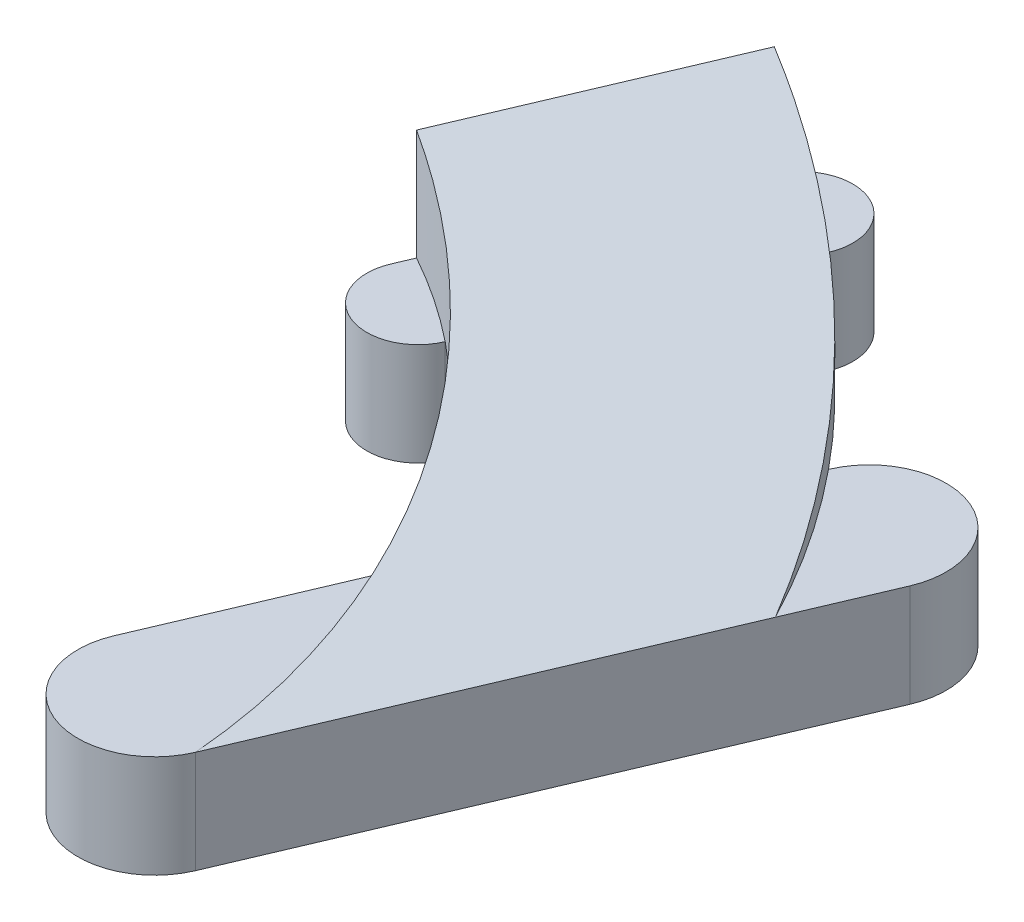
ISO-10303-21;
HEADER;
FILE_DESCRIPTION(('STEP AP214'),'2;1');
FILE_NAME('part.step','',(''),(''),'','','');
FILE_SCHEMA(('AUTOMOTIVE_DESIGN { 1 0 10303 214 1 1 1 1 }'));
ENDSEC;
DATA;
#1=APPLICATION_CONTEXT('core data for automotive mechanical design processes');
#2=APPLICATION_PROTOCOL_DEFINITION('international standard','automotive_design',2000,#1);
#3=PRODUCT_CONTEXT('',#1,'mechanical');
#4=PRODUCT('Part','Part','',(#3));
#5=PRODUCT_RELATED_PRODUCT_CATEGORY('part','',(#4));
#6=PRODUCT_DEFINITION_FORMATION('','',#4);
#7=PRODUCT_DEFINITION_CONTEXT('part definition',#1,'design');
#8=PRODUCT_DEFINITION('design','',#6,#7);
#9=PRODUCT_DEFINITION_SHAPE('','',#8);
#10=(LENGTH_UNIT() NAMED_UNIT(*) SI_UNIT(.MILLI.,.METRE.));
#11=(NAMED_UNIT(*) PLANE_ANGLE_UNIT() SI_UNIT($,.RADIAN.));
#12=(NAMED_UNIT(*) SI_UNIT($,.STERADIAN.) SOLID_ANGLE_UNIT());
#13=UNCERTAINTY_MEASURE_WITH_UNIT(LENGTH_MEASURE(1.E-05),#10,'distance_accuracy_value','');
#14=(GEOMETRIC_REPRESENTATION_CONTEXT(3) GLOBAL_UNCERTAINTY_ASSIGNED_CONTEXT((#13)) GLOBAL_UNIT_ASSIGNED_CONTEXT((#10,
#11,#12)) REPRESENTATION_CONTEXT('',''));
#15=CARTESIAN_POINT('',(0.,0.,0.));
#16=DIRECTION('',(0.,0.,1.));
#17=DIRECTION('',(1.,0.,0.));
#18=AXIS2_PLACEMENT_3D('',#15,#16,#17);
#19=CARTESIAN_POINT('',(-36.890166372958,0.,66.6749999998161));
#20=DIRECTION('',(0.,-1.,0.));
#21=DIRECTION('',(0.,0.,-1.));
#22=AXIS2_PLACEMENT_3D('',#19,#20,#21);
#23=PLANE('',#22);
#24=CARTESIAN_POINT('',(-36.890166372958,0.,66.6749999998161));
#25=DIRECTION('',(0.,-1.,0.));
#26=DIRECTION('',(0.,0.,-1.));
#27=AXIS2_PLACEMENT_3D('',#24,#25,#26);
#28=CIRCLE('',#27,76.2);
#29=CARTESIAN_POINT('',(10.7407382037323,0.,7.19612199084372));
#30=VERTEX_POINT('',#29);
#31=CARTESIAN_POINT('',(32.2384160665238,0.,34.6175657620646));
#32=VERTEX_POINT('',#31);
#33=EDGE_CURVE('E49',#30,#32,#28,.T.);
#34=ORIENTED_EDGE('',*,*,#33,.F.);
#35=DIRECTION('',(-0.391243575277503,0.,0.920287164315615));
#36=VECTOR('',#35,1.);
#37=CARTESIAN_POINT('',(10.7407382037323,0.,7.19612199084372));
#38=LINE('',#37,#36);
#39=CARTESIAN_POINT('',(24.25056074603,0.,-24.5818216317188));
#40=VERTEX_POINT('',#39);
#41=EDGE_CURVE('E236',#40,#30,#38,.T.);
#42=ORIENTED_EDGE('',*,*,#41,.F.);
#43=CARTESIAN_POINT('',(-36.890166372958,0.,66.6749999998161));
#44=DIRECTION('',(0.,1.,0.));
#45=DIRECTION('',(0.,0.,-1.));
#46=AXIS2_PLACEMENT_3D('',#43,#44,#45);
#47=CIRCLE('',#46,109.845327651787);
#48=CARTESIAN_POINT('',(48.1621218400422,0.,-2.83833883985335));
#49=VERTEX_POINT('',#48);
#50=EDGE_CURVE('E193',#49,#40,#47,.T.);
#51=ORIENTED_EDGE('',*,*,#50,.F.);
#52=DIRECTION('',(0.391243575277503,0.,-0.920287164315616));
#53=VECTOR('',#52,1.);
#54=CARTESIAN_POINT('',(32.2384160665238,0.,34.6175657620646));
#55=LINE('',#54,#53);
#56=EDGE_CURVE('E11',#32,#49,#55,.T.);
#57=ORIENTED_EDGE('',*,*,#56,.F.);
#58=EDGE_LOOP('',(#34,#42,#51,#57));
#59=FACE_BOUND('',#58,.T.);
#60=ADVANCED_FACE('F32',(#59),#23,.T.);
#61=CARTESIAN_POINT('',(-36.890166372958,13.716,66.6749999998161));
#62=DIRECTION('',(0.,-1.,0.));
#63=DIRECTION('',(0.,0.,-1.));
#64=AXIS2_PLACEMENT_3D('',#61,#62,#63);
#65=CYLINDRICAL_SURFACE('',#64,76.2);
#66=CARTESIAN_POINT('',(-36.890166372958,15.4482487149384,66.6749999998161));
#67=DIRECTION('',(0.197985801884462,0.976584361244738,0.0841701112294213));
#68=DIRECTION('',(-0.898738052524908,0.215134807439908,-0.382082357053463));
#69=AXIS2_PLACEMENT_3D('',#66,#67,#68);
#70=ELLIPSE('',#69,78.0270532930475,76.2);
#71=CARTESIAN_POINT('',(39.309833627042,0.,66.6750000001959));
#72=VERTEX_POINT('',#71);
#73=CARTESIAN_POINT('',(0.,13.716,0.));
#74=VERTEX_POINT('',#73);
#75=EDGE_CURVE('E180',#72,#74,#70,.T.);
#76=ORIENTED_EDGE('',*,*,#75,.T.);
#77=DIRECTION('',(0.,-1.,0.));
#78=VECTOR('',#77,1.);
#79=CARTESIAN_POINT('',(0.,13.716,0.));
#80=LINE('',#79,#78);
#81=CARTESIAN_POINT('',(0.,0.,0.));
#82=VERTEX_POINT('',#81);
#83=EDGE_CURVE('E189',#74,#82,#80,.T.);
#84=ORIENTED_EDGE('',*,*,#83,.T.);
#85=EDGE_CURVE('E191',#82,#30,#28,.T.);
#86=ORIENTED_EDGE('',*,*,#85,.T.);
#87=ORIENTED_EDGE('',*,*,#33,.T.);
#88=EDGE_CURVE('E184',#32,#72,#28,.T.);
#89=ORIENTED_EDGE('',*,*,#88,.T.);
#90=EDGE_LOOP('',(#76,#84,#86,#87,#89));
#91=FACE_BOUND('',#90,.T.);
#92=ADVANCED_FACE('F34',(#91),#65,.F.);
#93=CARTESIAN_POINT('',(-36.890166372958,13.716,66.6749999998161));
#94=DIRECTION('',(0.,-1.,0.));
#95=DIRECTION('',(0.,0.,-1.));
#96=AXIS2_PLACEMENT_3D('',#93,#94,#95);
#97=CYLINDRICAL_SURFACE('',#96,109.845327651787);
#98=CARTESIAN_POINT('',(-36.890166372958,15.4482487149384,66.6749999998161));
#99=DIRECTION('',(0.197985801884462,0.976584361244738,0.0841701112294213));
#100=DIRECTION('',(-0.898738052524908,0.215134807439908,-0.382082357053463));
#101=AXIS2_PLACEMENT_3D('',#98,#99,#100);
#102=ELLIPSE('',#101,112.479097567866,109.845327651699);
#103=CARTESIAN_POINT('',(13.212422732097,13.716,-31.0783967282718));
#104=VERTEX_POINT('',#103);
#105=CARTESIAN_POINT('',(60.7246268349765,0.,16.3029030226073));
#106=VERTEX_POINT('',#105);
#107=EDGE_CURVE('E181',#104,#106,#102,.F.);
#108=ORIENTED_EDGE('',*,*,#107,.T.);
#109=EDGE_CURVE('E190',#106,#49,#47,.T.);
#110=ORIENTED_EDGE('',*,*,#109,.T.);
#111=ORIENTED_EDGE('',*,*,#50,.T.);
#112=CARTESIAN_POINT('',(-36.890166372958,0.,66.6749999998161));
#113=DIRECTION('',(0.,-1.,0.));
#114=DIRECTION('',(0.,0.,-1.));
#115=AXIS2_PLACEMENT_3D('',#112,#113,#114);
#116=CIRCLE('',#115,109.845327651787);
#117=CARTESIAN_POINT('',(13.2124227320926,0.,-31.0783967282589));
#118=VERTEX_POINT('',#117);
#119=EDGE_CURVE('E143',#118,#40,#116,.T.);
#120=ORIENTED_EDGE('',*,*,#119,.F.);
#121=DIRECTION('',(0.,-1.,0.));
#122=VECTOR('',#121,1.);
#123=CARTESIAN_POINT('',(13.212422732086,13.716,-31.0783967282459));
#124=LINE('',#123,#122);
#125=EDGE_CURVE('E196',#104,#118,#124,.T.);
#126=ORIENTED_EDGE('',*,*,#125,.F.);
#127=EDGE_LOOP('',(#108,#110,#111,#120,#126));
#128=FACE_BOUND('',#127,.T.);
#129=ADVANCED_FACE('F232',(#128),#97,.T.);
#130=CARTESIAN_POINT('',(0.,13.716,0.));
#131=DIRECTION('',(0.920287164315627,0.,0.391243575277477));
#132=DIRECTION('',(0.391243575277477,0.,-0.920287164315627));
#133=AXIS2_PLACEMENT_3D('',#130,#131,#132);
#134=PLANE('',#133);
#135=ORIENTED_EDGE('',*,*,#125,.T.);
#136=DIRECTION('',(0.,1.,0.));
#137=VECTOR('',#136,1.);
#138=CARTESIAN_POINT('',(13.2124227320926,-12.7,-31.0783967282589));
#139=LINE('',#138,#137);
#140=CARTESIAN_POINT('',(13.2124227320926,-12.7,-31.0783967282589));
#141=VERTEX_POINT('',#140);
#142=EDGE_CURVE('E246',#141,#118,#139,.T.);
#143=ORIENTED_EDGE('',*,*,#142,.F.);
#144=DIRECTION('',(0.391243575277504,0.,-0.920287164315615));
#145=VECTOR('',#144,1.);
#146=CARTESIAN_POINT('',(0.,-12.7,0.));
#147=LINE('',#146,#145);
#148=CARTESIAN_POINT('',(-0.946908783075986,-12.7,2.22732858481943));
#149=VERTEX_POINT('',#148);
#150=EDGE_CURVE('E136',#149,#141,#147,.T.);
#151=ORIENTED_EDGE('',*,*,#150,.F.);
#152=DIRECTION('',(0.,1.,0.));
#153=VECTOR('',#152,1.);
#154=CARTESIAN_POINT('',(-0.946908783075986,-12.7,2.22732858481943));
#155=LINE('',#154,#153);
#156=CARTESIAN_POINT('',(-0.946908783075986,0.,2.22732858481943));
#157=VERTEX_POINT('',#156);
#158=EDGE_CURVE('E146',#149,#157,#155,.T.);
#159=ORIENTED_EDGE('',*,*,#158,.T.);
#160=DIRECTION('',(0.391243575277503,0.,-0.920287164315615));
#161=VECTOR('',#160,1.);
#162=CARTESIAN_POINT('',(0.,0.,0.));
#163=LINE('',#162,#161);
#164=EDGE_CURVE('E57',#157,#82,#163,.T.);
#165=ORIENTED_EDGE('',*,*,#164,.T.);
#166=ORIENTED_EDGE('',*,*,#83,.F.);
#167=DIRECTION('',(-0.391243575277477,0.,0.920287164315627));
#168=VECTOR('',#167,1.);
#169=CARTESIAN_POINT('',(0.,13.716,0.));
#170=LINE('',#169,#168);
#171=EDGE_CURVE('E187',#104,#74,#170,.T.);
#172=ORIENTED_EDGE('',*,*,#171,.F.);
#173=EDGE_LOOP('',(#135,#143,#151,#159,#165,#166,#172));
#174=FACE_BOUND('',#173,.T.);
#175=ADVANCED_FACE('F248',(#174),#134,.F.);
#176=CARTESIAN_POINT('',(2.65198637620934,13.0811825726348,1.12744442348807));
#177=DIRECTION('',(0.197985801884462,0.976584361244738,0.0841701112294213));
#178=DIRECTION('',(-0.980062210095116,0.198690876346843,0.));
#179=AXIS2_PLACEMENT_3D('',#176,#177,#178);
#180=PLANE('',#179);
#181=ORIENTED_EDGE('',*,*,#107,.F.);
#182=ORIENTED_EDGE('',*,*,#171,.T.);
#183=ORIENTED_EDGE('',*,*,#75,.F.);
#184=DIRECTION('',(-0.391243575277477,0.,0.920287164315627));
#185=VECTOR('',#184,1.);
#186=CARTESIAN_POINT('',(27.645782645251,0.,94.1113007620741));
#187=LINE('',#186,#185);
#188=EDGE_CURVE('E36',#106,#72,#187,.T.);
#189=ORIENTED_EDGE('',*,*,#188,.F.);
#190=EDGE_LOOP('',(#181,#182,#183,#189));
#191=FACE_BOUND('',#190,.T.);
#192=ADVANCED_FACE('F254',(#191),#180,.T.);
#193=CARTESIAN_POINT('',(30.5440983869256,0.,62.9484049456733));
#194=DIRECTION('',(0.,1.,0.));
#195=DIRECTION('',(0.,0.,1.));
#196=AXIS2_PLACEMENT_3D('',#193,#194,#195);
#197=PLANE('',#196);
#198=ORIENTED_EDGE('',*,*,#109,.F.);
#199=DIRECTION('',(-0.39124357527732,0.,0.920287164315693));
#200=VECTOR('',#199,1.);
#201=CARTESIAN_POINT('',(60.7246268349635,0.,16.3029030226139));
#202=LINE('',#201,#200);
#203=CARTESIAN_POINT('',(65.6935923202547,0.,4.61485126918324));
#204=VERTEX_POINT('',#203);
#205=EDGE_CURVE('E164',#204,#106,#202,.T.);
#206=ORIENTED_EDGE('',*,*,#205,.F.);
#207=CARTESIAN_POINT('',(56.9278570801484,0.,0.888256214664995));
#208=DIRECTION('',(0.,-1.,0.));
#209=DIRECTION('',(0.,0.,-1.));
#210=AXIS2_PLACEMENT_3D('',#207,#208,#209);
#211=CIRCLE('',#210,9.52500000000002);
#212=EDGE_CURVE('E161',#49,#204,#211,.T.);
#213=ORIENTED_EDGE('',*,*,#212,.F.);
#214=EDGE_LOOP('',(#198,#206,#213));
#215=FACE_BOUND('',#214,.T.);
#216=ADVANCED_FACE('F228',(#215),#197,.T.);
#217=ORIENTED_EDGE('',*,*,#88,.F.);
#218=CARTESIAN_POINT('',(21.7783631468092,0.,59.2218098911507));
#219=VERTEX_POINT('',#218);
#220=EDGE_CURVE('E42',#219,#32,#55,.T.);
#221=ORIENTED_EDGE('',*,*,#220,.F.);
#222=CARTESIAN_POINT('',(30.5440983869256,0.,62.9484049456733));
#223=DIRECTION('',(0.,-1.,0.));
#224=DIRECTION('',(0.,0.,1.));
#225=AXIS2_PLACEMENT_3D('',#222,#223,#224);
#226=CIRCLE('',#225,9.52500000001108);
#227=EDGE_CURVE('E153',#72,#219,#226,.T.);
#228=ORIENTED_EDGE('',*,*,#227,.F.);
#229=EDGE_LOOP('',(#217,#221,#228));
#230=FACE_BOUND('',#229,.T.);
#231=ADVANCED_FACE('F214',(#230),#197,.T.);
#232=CARTESIAN_POINT('',(32.2384160665238,-12.7,34.6175657620646));
#233=DIRECTION('',(0.920287164315616,0.,0.391243575277503));
#234=DIRECTION('',(0.391243575277503,0.,-0.920287164315616));
#235=AXIS2_PLACEMENT_3D('',#232,#233,#234);
#236=PLANE('',#235);
#237=ORIENTED_EDGE('',*,*,#220,.T.);
#238=ORIENTED_EDGE('',*,*,#56,.T.);
#239=DIRECTION('',(0.,1.,0.));
#240=VECTOR('',#239,1.);
#241=CARTESIAN_POINT('',(48.1621218400422,-12.7,-2.83833883985335));
#242=LINE('',#241,#240);
#243=CARTESIAN_POINT('',(48.1621218400422,-12.7,-2.83833883985335));
#244=VERTEX_POINT('',#243);
#245=EDGE_CURVE('E177',#244,#49,#242,.T.);
#246=ORIENTED_EDGE('',*,*,#245,.F.);
#247=DIRECTION('',(0.391243575277892,0.,-0.92028716431545));
#248=VECTOR('',#247,1.);
#249=CARTESIAN_POINT('',(32.2384160665238,-12.7,34.6175657620646));
#250=LINE('',#249,#248);
#251=CARTESIAN_POINT('',(21.7783631468092,-12.7,59.2218098911507));
#252=VERTEX_POINT('',#251);
#253=EDGE_CURVE('E150',#252,#244,#250,.T.);
#254=ORIENTED_EDGE('',*,*,#253,.F.);
#255=DIRECTION('',(0.,1.,0.));
#256=VECTOR('',#255,1.);
#257=CARTESIAN_POINT('',(21.7783631468092,-12.7,59.2218098911507));
#258=LINE('',#257,#256);
#259=EDGE_CURVE('E158',#252,#219,#258,.T.);
#260=ORIENTED_EDGE('',*,*,#259,.T.);
#261=EDGE_LOOP('',(#237,#238,#246,#254,#260));
#262=FACE_BOUND('',#261,.T.);
#263=ADVANCED_FACE('F216',(#262),#236,.F.);
#264=CARTESIAN_POINT('',(56.9278570801484,-12.7,0.888256214664995));
#265=DIRECTION('',(0.,1.,0.));
#266=DIRECTION('',(0.,0.,1.));
#267=AXIS2_PLACEMENT_3D('',#264,#265,#266);
#268=CYLINDRICAL_SURFACE('',#267,9.52500000000002);
#269=ORIENTED_EDGE('',*,*,#212,.T.);
#270=DIRECTION('',(0.,1.,0.));
#271=VECTOR('',#270,1.);
#272=CARTESIAN_POINT('',(65.6935923202547,-12.7,4.61485126918324));
#273=LINE('',#272,#271);
#274=CARTESIAN_POINT('',(65.6935923202547,-12.7,4.61485126918324));
#275=VERTEX_POINT('',#274);
#276=EDGE_CURVE('E174',#275,#204,#273,.T.);
#277=ORIENTED_EDGE('',*,*,#276,.F.);
#278=CARTESIAN_POINT('',(56.9278570801484,-12.7,0.888256214664995));
#279=DIRECTION('',(0.,-1.,0.));
#280=DIRECTION('',(0.,0.,-1.));
#281=AXIS2_PLACEMENT_3D('',#278,#279,#280);
#282=CIRCLE('',#281,9.52500000000002);
#283=EDGE_CURVE('E152',#244,#275,#282,.T.);
#284=ORIENTED_EDGE('',*,*,#283,.F.);
#285=ORIENTED_EDGE('',*,*,#245,.T.);
#286=EDGE_LOOP('',(#269,#277,#284,#285));
#287=FACE_BOUND('',#286,.T.);
#288=ADVANCED_FACE('F224',(#287),#268,.T.);
#289=CARTESIAN_POINT('',(60.7246268349635,-12.7,16.3029030226139));
#290=DIRECTION('',(-0.920287164315693,0.,-0.39124357527732));
#291=DIRECTION('',(-0.39124357527732,0.,0.920287164315693));
#292=AXIS2_PLACEMENT_3D('',#289,#290,#291);
#293=PLANE('',#292);
#294=ORIENTED_EDGE('',*,*,#205,.T.);
#295=ORIENTED_EDGE('',*,*,#188,.T.);
#296=DIRECTION('',(0.,1.,0.));
#297=VECTOR('',#296,1.);
#298=CARTESIAN_POINT('',(39.309833627042,-12.7,66.6750000001959));
#299=LINE('',#298,#297);
#300=CARTESIAN_POINT('',(39.309833627042,-12.7,66.6750000001959));
#301=VERTEX_POINT('',#300);
#302=EDGE_CURVE('E171',#301,#72,#299,.T.);
#303=ORIENTED_EDGE('',*,*,#302,.F.);
#304=DIRECTION('',(-0.391243575277507,0.,0.920287164315614));
#305=VECTOR('',#304,1.);
#306=CARTESIAN_POINT('',(60.7246268349635,-12.7,16.3029030226139));
#307=LINE('',#306,#305);
#308=EDGE_CURVE('E155',#275,#301,#307,.T.);
#309=ORIENTED_EDGE('',*,*,#308,.F.);
#310=ORIENTED_EDGE('',*,*,#276,.T.);
#311=EDGE_LOOP('',(#294,#295,#303,#309,#310));
#312=FACE_BOUND('',#311,.T.);
#313=ADVANCED_FACE('F203',(#312),#293,.F.);
#314=CARTESIAN_POINT('',(30.5440983869256,-12.7,62.9484049456733));
#315=DIRECTION('',(0.,1.,0.));
#316=DIRECTION('',(0.,0.,1.));
#317=AXIS2_PLACEMENT_3D('',#314,#315,#316);
#318=CYLINDRICAL_SURFACE('',#317,9.52500000001108);
#319=ORIENTED_EDGE('',*,*,#227,.T.);
#320=ORIENTED_EDGE('',*,*,#259,.F.);
#321=CARTESIAN_POINT('',(30.5440983869256,-12.7,62.9484049456733));
#322=DIRECTION('',(0.,-1.,0.));
#323=DIRECTION('',(0.,0.,1.));
#324=AXIS2_PLACEMENT_3D('',#321,#322,#323);
#325=CIRCLE('',#324,9.52500000001108);
#326=EDGE_CURVE('E157',#301,#252,#325,.T.);
#327=ORIENTED_EDGE('',*,*,#326,.F.);
#328=ORIENTED_EDGE('',*,*,#302,.T.);
#329=EDGE_LOOP('',(#319,#320,#327,#328));
#330=FACE_BOUND('',#329,.T.);
#331=ADVANCED_FACE('F210',(#330),#318,.T.);
#332=CARTESIAN_POINT('',(30.5440983869256,-12.7,62.9484049456733));
#333=DIRECTION('',(0.,1.,0.));
#334=DIRECTION('',(0.,0.,1.));
#335=AXIS2_PLACEMENT_3D('',#332,#333,#334);
#336=PLANE('',#335);
#337=ORIENTED_EDGE('',*,*,#253,.T.);
#338=ORIENTED_EDGE('',*,*,#283,.T.);
#339=ORIENTED_EDGE('',*,*,#308,.T.);
#340=ORIENTED_EDGE('',*,*,#326,.T.);
#341=EDGE_LOOP('',(#337,#338,#339,#340));
#342=FACE_BOUND('',#341,.T.);
#343=ADVANCED_FACE('F221',(#342),#336,.F.);
#344=CARTESIAN_POINT('',(19.0562462254968,0.,-28.5940000252466));
#345=DIRECTION('',(0.,-1.,0.));
#346=DIRECTION('',(0.,0.,-1.));
#347=AXIS2_PLACEMENT_3D('',#344,#345,#346);
#348=PLANE('',#347);
#349=CARTESIAN_POINT('',(4.89691471032817,0.,4.71172528783155));
#350=DIRECTION('',(0.,-1.,0.));
#351=DIRECTION('',(0.,0.,-1.));
#352=AXIS2_PLACEMENT_3D('',#349,#350,#351);
#353=CIRCLE('',#352,6.35);
#354=EDGE_CURVE('E239',#30,#157,#353,.T.);
#355=ORIENTED_EDGE('',*,*,#354,.F.);
#356=ORIENTED_EDGE('',*,*,#85,.F.);
#357=ORIENTED_EDGE('',*,*,#164,.F.);
#358=EDGE_LOOP('',(#355,#356,#357));
#359=FACE_BOUND('',#358,.T.);
#360=ADVANCED_FACE('F253',(#359),#348,.F.);
#361=CARTESIAN_POINT('',(19.0562462254968,0.,-28.5940000252466));
#362=DIRECTION('',(0.,-1.,0.));
#363=DIRECTION('',(0.,0.,-1.));
#364=AXIS2_PLACEMENT_3D('',#361,#362,#363);
#365=CIRCLE('',#364,6.35000000000005);
#366=CARTESIAN_POINT('',(24.9000697189009,0.,-26.1096033222345));
#367=VERTEX_POINT('',#366);
#368=EDGE_CURVE('E142',#118,#367,#365,.T.);
#369=ORIENTED_EDGE('',*,*,#368,.F.);
#370=ORIENTED_EDGE('',*,*,#119,.T.);
#371=EDGE_CURVE('E237',#367,#40,#38,.T.);
#372=ORIENTED_EDGE('',*,*,#371,.F.);
#373=EDGE_LOOP('',(#369,#370,#372));
#374=FACE_BOUND('',#373,.T.);
#375=ADVANCED_FACE('F256',(#374),#348,.F.);
#376=CARTESIAN_POINT('',(19.0562462254968,-12.7,-28.5940000252466));
#377=DIRECTION('',(0.,1.,0.));
#378=DIRECTION('',(0.,0.,1.));
#379=AXIS2_PLACEMENT_3D('',#376,#377,#378);
#380=CYLINDRICAL_SURFACE('',#379,6.35000000000005);
#381=ORIENTED_EDGE('',*,*,#368,.T.);
#382=DIRECTION('',(0.,1.,0.));
#383=VECTOR('',#382,1.);
#384=CARTESIAN_POINT('',(24.9000697189009,-12.7,-26.1096033222345));
#385=LINE('',#384,#383);
#386=CARTESIAN_POINT('',(24.9000697189009,-12.7,-26.1096033222345));
#387=VERTEX_POINT('',#386);
#388=EDGE_CURVE('E124',#387,#367,#385,.T.);
#389=ORIENTED_EDGE('',*,*,#388,.F.);
#390=CARTESIAN_POINT('',(19.0562462254968,-12.7,-28.5940000252466));
#391=DIRECTION('',(0.,-1.,0.));
#392=DIRECTION('',(0.,0.,-1.));
#393=AXIS2_PLACEMENT_3D('',#390,#391,#392);
#394=CIRCLE('',#393,6.35000000000005);
#395=EDGE_CURVE('E131',#141,#387,#394,.T.);
#396=ORIENTED_EDGE('',*,*,#395,.F.);
#397=ORIENTED_EDGE('',*,*,#142,.T.);
#398=EDGE_LOOP('',(#381,#389,#396,#397));
#399=FACE_BOUND('',#398,.T.);
#400=ADVANCED_FACE('F140',(#399),#380,.T.);
#401=CARTESIAN_POINT('',(10.7407382037323,-12.7,7.19612199084372));
#402=DIRECTION('',(-0.920287164315616,0.,-0.391243575277503));
#403=DIRECTION('',(-0.391243575277503,0.,0.920287164315615));
#404=AXIS2_PLACEMENT_3D('',#401,#402,#403);
#405=PLANE('',#404);
#406=ORIENTED_EDGE('',*,*,#371,.T.);
#407=ORIENTED_EDGE('',*,*,#41,.T.);
#408=DIRECTION('',(0.,1.,0.));
#409=VECTOR('',#408,1.);
#410=CARTESIAN_POINT('',(10.7407382037323,-12.7,7.19612199084372));
#411=LINE('',#410,#409);
#412=CARTESIAN_POINT('',(10.7407382037323,-12.7,7.19612199084372));
#413=VERTEX_POINT('',#412);
#414=EDGE_CURVE('E127',#413,#30,#411,.T.);
#415=ORIENTED_EDGE('',*,*,#414,.F.);
#416=DIRECTION('',(-0.39124357527756,0.,0.920287164315591));
#417=VECTOR('',#416,1.);
#418=CARTESIAN_POINT('',(24.9000697189009,-12.7,-26.1096033222345));
#419=LINE('',#418,#417);
#420=EDGE_CURVE('E119',#387,#413,#419,.T.);
#421=ORIENTED_EDGE('',*,*,#420,.F.);
#422=ORIENTED_EDGE('',*,*,#388,.T.);
#423=EDGE_LOOP('',(#406,#407,#415,#421,#422));
#424=FACE_BOUND('',#423,.T.);
#425=ADVANCED_FACE('F122',(#424),#405,.F.);
#426=CARTESIAN_POINT('',(4.89691471032817,-12.7,4.71172528783155));
#427=DIRECTION('',(0.,1.,0.));
#428=DIRECTION('',(0.,0.,1.));
#429=AXIS2_PLACEMENT_3D('',#426,#427,#428);
#430=CYLINDRICAL_SURFACE('',#429,6.35);
#431=ORIENTED_EDGE('',*,*,#354,.T.);
#432=ORIENTED_EDGE('',*,*,#158,.F.);
#433=CARTESIAN_POINT('',(4.89691471032817,-12.7,4.71172528783155));
#434=DIRECTION('',(0.,-1.,0.));
#435=DIRECTION('',(0.,0.,-1.));
#436=AXIS2_PLACEMENT_3D('',#433,#434,#435);
#437=CIRCLE('',#436,6.35);
#438=EDGE_CURVE('E130',#413,#149,#437,.T.);
#439=ORIENTED_EDGE('',*,*,#438,.F.);
#440=ORIENTED_EDGE('',*,*,#414,.T.);
#441=EDGE_LOOP('',(#431,#432,#439,#440));
#442=FACE_BOUND('',#441,.T.);
#443=ADVANCED_FACE('F250',(#442),#430,.T.);
#444=CARTESIAN_POINT('',(19.0562462254968,-12.7,-28.5940000252466));
#445=DIRECTION('',(0.,-1.,0.));
#446=DIRECTION('',(0.,0.,-1.));
#447=AXIS2_PLACEMENT_3D('',#444,#445,#446);
#448=PLANE('',#447);
#449=ORIENTED_EDGE('',*,*,#395,.T.);
#450=ORIENTED_EDGE('',*,*,#420,.T.);
#451=ORIENTED_EDGE('',*,*,#438,.T.);
#452=ORIENTED_EDGE('',*,*,#150,.T.);
#453=EDGE_LOOP('',(#449,#450,#451,#452));
#454=FACE_BOUND('',#453,.T.);
#455=ADVANCED_FACE('F134',(#454),#448,.T.);
#456=CLOSED_SHELL('',(#60,#92,#129,#175,#192,#216,#231,#263,#288,#313,#331,#343,#360,#375,#400,
#425,#443,#455));
#457=MANIFOLD_SOLID_BREP('B2',#456);
#458=ADVANCED_BREP_SHAPE_REPRESENTATION('',(#18,#457),#14);
#459=SHAPE_DEFINITION_REPRESENTATION(#9,#458);
ENDSEC;
END-ISO-10303-21;
